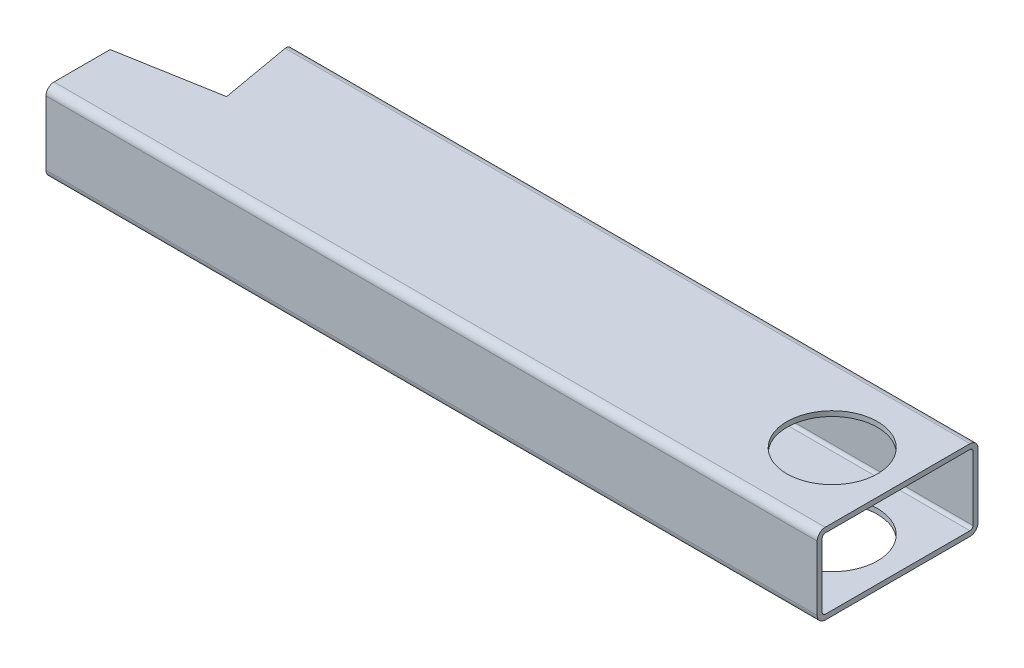
ISO-10303-21;
HEADER;
FILE_DESCRIPTION(('STEP AP214'),'2;1');
FILE_NAME('part.step','',(''),(''),'','','');
FILE_SCHEMA(('AUTOMOTIVE_DESIGN { 1 0 10303 214 1 1 1 1 }'));
ENDSEC;
DATA;
#1=APPLICATION_CONTEXT('core data for automotive mechanical design processes');
#2=APPLICATION_PROTOCOL_DEFINITION('international standard','automotive_design',2000,#1);
#3=PRODUCT_CONTEXT('',#1,'mechanical');
#4=PRODUCT('Part','Part','',(#3));
#5=PRODUCT_RELATED_PRODUCT_CATEGORY('part','',(#4));
#6=PRODUCT_DEFINITION_FORMATION('','',#4);
#7=PRODUCT_DEFINITION_CONTEXT('part definition',#1,'design');
#8=PRODUCT_DEFINITION('design','',#6,#7);
#9=PRODUCT_DEFINITION_SHAPE('','',#8);
#10=(LENGTH_UNIT() NAMED_UNIT(*) SI_UNIT(.MILLI.,.METRE.));
#11=(NAMED_UNIT(*) PLANE_ANGLE_UNIT() SI_UNIT($,.RADIAN.));
#12=(NAMED_UNIT(*) SI_UNIT($,.STERADIAN.) SOLID_ANGLE_UNIT());
#13=UNCERTAINTY_MEASURE_WITH_UNIT(LENGTH_MEASURE(1.E-05),#10,'distance_accuracy_value','');
#14=(GEOMETRIC_REPRESENTATION_CONTEXT(3) GLOBAL_UNCERTAINTY_ASSIGNED_CONTEXT((#13)) GLOBAL_UNIT_ASSIGNED_CONTEXT((#10,
#11,#12)) REPRESENTATION_CONTEXT('',''));
#15=CARTESIAN_POINT('',(0.,0.,0.));
#16=DIRECTION('',(0.,0.,1.));
#17=DIRECTION('',(1.,0.,0.));
#18=AXIS2_PLACEMENT_3D('',#15,#16,#17);
#19=CARTESIAN_POINT('',(-243.6368,2.53999999999999,48.26));
#20=DIRECTION('',(1.,0.,0.));
#21=DIRECTION('',(0.,0.,-1.));
#22=AXIS2_PLACEMENT_3D('',#19,#20,#21);
#23=CYLINDRICAL_SURFACE('',#22,2.54);
#24=CARTESIAN_POINT('',(0.,2.53999999999999,48.26));
#25=DIRECTION('',(1.,0.,0.));
#26=DIRECTION('',(0.,0.,-1.));
#27=AXIS2_PLACEMENT_3D('',#24,#25,#26);
#28=CIRCLE('',#27,2.54);
#29=CARTESIAN_POINT('',(0.,2.54000000000001,50.8));
#30=VERTEX_POINT('',#29);
#31=CARTESIAN_POINT('',(0.,0.,48.26));
#32=VERTEX_POINT('',#31);
#33=EDGE_CURVE('E381',#30,#32,#28,.T.);
#34=ORIENTED_EDGE('',*,*,#33,.F.);
#35=DIRECTION('',(1.,0.,0.));
#36=VECTOR('',#35,1.);
#37=CARTESIAN_POINT('',(-243.6368,2.54000000000001,50.8));
#38=LINE('',#37,#36);
#39=CARTESIAN_POINT('',(-243.6368,2.54000000000001,50.8));
#40=VERTEX_POINT('',#39);
#41=EDGE_CURVE('E448',#40,#30,#38,.T.);
#42=ORIENTED_EDGE('',*,*,#41,.F.);
#43=CARTESIAN_POINT('',(-243.6368,2.53999999999999,48.26));
#44=DIRECTION('',(1.,0.,0.));
#45=DIRECTION('',(0.,0.,-1.));
#46=AXIS2_PLACEMENT_3D('',#43,#44,#45);
#47=CIRCLE('',#46,2.54);
#48=CARTESIAN_POINT('',(-243.6368,0.,48.26));
#49=VERTEX_POINT('',#48);
#50=EDGE_CURVE('E402',#40,#49,#47,.T.);
#51=ORIENTED_EDGE('',*,*,#50,.T.);
#52=DIRECTION('',(1.,0.,0.));
#53=VECTOR('',#52,1.);
#54=CARTESIAN_POINT('',(-243.6368,0.,48.26));
#55=LINE('',#54,#53);
#56=EDGE_CURVE('E420',#49,#32,#55,.T.);
#57=ORIENTED_EDGE('',*,*,#56,.T.);
#58=EDGE_LOOP('',(#34,#42,#51,#57));
#59=FACE_BOUND('',#58,.T.);
#60=ADVANCED_FACE('F93',(#59),#23,.T.);
#61=CARTESIAN_POINT('',(-243.6368,2.54000000000001,50.8));
#62=DIRECTION('',(0.,0.,1.));
#63=DIRECTION('',(1.,0.,0.));
#64=AXIS2_PLACEMENT_3D('',#61,#62,#63);
#65=PLANE('',#64);
#66=DIRECTION('',(0.,-1.,0.));
#67=VECTOR('',#66,1.);
#68=CARTESIAN_POINT('',(0.,2.54000000000001,50.8));
#69=LINE('',#68,#67);
#70=CARTESIAN_POINT('',(0.,22.86,50.8));
#71=VERTEX_POINT('',#70);
#72=EDGE_CURVE('E406',#71,#30,#69,.T.);
#73=ORIENTED_EDGE('',*,*,#72,.F.);
#74=DIRECTION('',(1.,0.,0.));
#75=VECTOR('',#74,1.);
#76=CARTESIAN_POINT('',(-243.6368,22.86,50.8));
#77=LINE('',#76,#75);
#78=CARTESIAN_POINT('',(-243.6368,22.86,50.8));
#79=VERTEX_POINT('',#78);
#80=EDGE_CURVE('E451',#79,#71,#77,.T.);
#81=ORIENTED_EDGE('',*,*,#80,.F.);
#82=DIRECTION('',(0.,-1.,0.));
#83=VECTOR('',#82,1.);
#84=CARTESIAN_POINT('',(-243.6368,2.54000000000001,50.8));
#85=LINE('',#84,#83);
#86=EDGE_CURVE('E416',#79,#40,#85,.T.);
#87=ORIENTED_EDGE('',*,*,#86,.T.);
#88=ORIENTED_EDGE('',*,*,#41,.T.);
#89=EDGE_LOOP('',(#73,#81,#87,#88));
#90=FACE_BOUND('',#89,.T.);
#91=ADVANCED_FACE('F542',(#90),#65,.T.);
#92=CARTESIAN_POINT('',(-243.6368,22.86,48.26));
#93=DIRECTION('',(1.,0.,0.));
#94=DIRECTION('',(0.,0.,-1.));
#95=AXIS2_PLACEMENT_3D('',#92,#93,#94);
#96=CYLINDRICAL_SURFACE('',#95,2.54);
#97=CARTESIAN_POINT('',(0.,22.86,48.26));
#98=DIRECTION('',(1.,0.,0.));
#99=DIRECTION('',(0.,0.,-1.));
#100=AXIS2_PLACEMENT_3D('',#97,#98,#99);
#101=CIRCLE('',#100,2.54);
#102=CARTESIAN_POINT('',(0.,25.4,48.26));
#103=VERTEX_POINT('',#102);
#104=EDGE_CURVE('E441',#103,#71,#101,.T.);
#105=ORIENTED_EDGE('',*,*,#104,.F.);
#106=DIRECTION('',(1.,0.,0.));
#107=VECTOR('',#106,1.);
#108=CARTESIAN_POINT('',(-243.6368,25.4,48.26));
#109=LINE('',#108,#107);
#110=CARTESIAN_POINT('',(-243.6368,25.4,48.26));
#111=VERTEX_POINT('',#110);
#112=EDGE_CURVE('E454',#111,#103,#109,.T.);
#113=ORIENTED_EDGE('',*,*,#112,.F.);
#114=CARTESIAN_POINT('',(-243.6368,22.86,48.26));
#115=DIRECTION('',(1.,0.,0.));
#116=DIRECTION('',(0.,0.,-1.));
#117=AXIS2_PLACEMENT_3D('',#114,#115,#116);
#118=CIRCLE('',#117,2.54);
#119=EDGE_CURVE('E412',#111,#79,#118,.T.);
#120=ORIENTED_EDGE('',*,*,#119,.T.);
#121=ORIENTED_EDGE('',*,*,#80,.T.);
#122=EDGE_LOOP('',(#105,#113,#120,#121));
#123=FACE_BOUND('',#122,.T.);
#124=ADVANCED_FACE('F546',(#123),#96,.T.);
#125=CARTESIAN_POINT('',(-243.6368,25.4,2.54000000000002));
#126=DIRECTION('',(0.,1.,0.));
#127=DIRECTION('',(0.,0.,1.));
#128=AXIS2_PLACEMENT_3D('',#125,#126,#127);
#129=PLANE('',#128);
#130=CARTESIAN_POINT('',(-20.6629,25.4,25.4));
#131=DIRECTION('',(0.,1.,0.));
#132=DIRECTION('',(0.,0.,1.));
#133=AXIS2_PLACEMENT_3D('',#130,#131,#132);
#134=CIRCLE('',#133,14.3129);
#135=CARTESIAN_POINT('',(-20.6629,25.4,39.7129));
#136=VERTEX_POINT('',#135);
#137=EDGE_CURVE('E327',#136,#136,#134,.T.);
#138=ORIENTED_EDGE('',*,*,#137,.F.);
#139=EDGE_LOOP('',(#138));
#140=FACE_BOUND('',#139,.T.);
#141=DIRECTION('',(-0.173648177666935,0.,-0.984807753012207));
#142=VECTOR('',#141,1.);
#143=CARTESIAN_POINT('',(-217.155289085019,25.4,-2.1294048642369));
#144=LINE('',#143,#142);
#145=CARTESIAN_POINT('',(-212.369153841862,25.4,25.01411692651));
#146=VERTEX_POINT('',#145);
#147=CARTESIAN_POINT('',(-216.331947023603,25.4,2.54000000000002));
#148=VERTEX_POINT('',#147);
#149=EDGE_CURVE('E320',#146,#148,#144,.T.);
#150=ORIENTED_EDGE('',*,*,#149,.F.);
#151=DIRECTION('',(0.984807753012207,0.,-0.173648177666935));
#152=VECTOR('',#151,1.);
#153=CARTESIAN_POINT('',(-238.850664756843,25.4,29.6835217907469));
#154=LINE('',#153,#152);
#155=CARTESIAN_POINT('',(-243.6368,25.4,30.5274465674352));
#156=VERTEX_POINT('',#155);
#157=EDGE_CURVE('E296',#156,#146,#154,.T.);
#158=ORIENTED_EDGE('',*,*,#157,.F.);
#159=DIRECTION('',(0.,0.,1.));
#160=VECTOR('',#159,1.);
#161=CARTESIAN_POINT('',(-243.6368,25.4,2.54000000000002));
#162=LINE('',#161,#160);
#163=EDGE_CURVE('E409',#156,#111,#162,.T.);
#164=ORIENTED_EDGE('',*,*,#163,.T.);
#165=ORIENTED_EDGE('',*,*,#112,.T.);
#166=DIRECTION('',(0.,0.,1.));
#167=VECTOR('',#166,1.);
#168=CARTESIAN_POINT('',(0.,25.4,2.54000000000002));
#169=LINE('',#168,#167);
#170=CARTESIAN_POINT('',(0.,25.4,2.54000000000002));
#171=VERTEX_POINT('',#170);
#172=EDGE_CURVE('E437',#171,#103,#169,.T.);
#173=ORIENTED_EDGE('',*,*,#172,.F.);
#174=DIRECTION('',(1.,0.,0.));
#175=VECTOR('',#174,1.);
#176=CARTESIAN_POINT('',(-243.6368,25.4,2.54000000000002));
#177=LINE('',#176,#175);
#178=EDGE_CURVE('E457',#148,#171,#177,.T.);
#179=ORIENTED_EDGE('',*,*,#178,.F.);
#180=EDGE_LOOP('',(#150,#158,#164,#165,#173,#179));
#181=FACE_BOUND('',#180,.T.);
#182=ADVANCED_FACE('F525',(#140,#181),#129,.T.);
#183=CARTESIAN_POINT('',(-243.6368,22.86,2.54));
#184=DIRECTION('',(1.,0.,0.));
#185=DIRECTION('',(0.,0.,-1.));
#186=AXIS2_PLACEMENT_3D('',#183,#184,#185);
#187=CYLINDRICAL_SURFACE('',#186,2.54);
#188=CARTESIAN_POINT('',(-216.331947023603,22.86,2.54));
#189=DIRECTION('',(0.984807753012207,0.,-0.173648177666935));
#190=DIRECTION('',(0.173648177666935,0.,0.984807753012207));
#191=AXIS2_PLACEMENT_3D('',#188,#189,#190);
#192=ELLIPSE('',#191,2.57918359418979,2.54);
#193=CARTESIAN_POINT('',(-216.779817554603,22.86,0.));
#194=VERTEX_POINT('',#193);
#195=EDGE_CURVE('E317',#148,#194,#192,.F.);
#196=ORIENTED_EDGE('',*,*,#195,.F.);
#197=ORIENTED_EDGE('',*,*,#178,.T.);
#198=CARTESIAN_POINT('',(0.,22.86,2.54));
#199=DIRECTION('',(1.,0.,0.));
#200=DIRECTION('',(0.,0.,-1.));
#201=AXIS2_PLACEMENT_3D('',#198,#199,#200);
#202=CIRCLE('',#201,2.54);
#203=CARTESIAN_POINT('',(0.,22.86,0.));
#204=VERTEX_POINT('',#203);
#205=EDGE_CURVE('E434',#204,#171,#202,.T.);
#206=ORIENTED_EDGE('',*,*,#205,.F.);
#207=DIRECTION('',(1.,0.,0.));
#208=VECTOR('',#207,1.);
#209=CARTESIAN_POINT('',(-243.6368,22.86,0.));
#210=LINE('',#209,#208);
#211=EDGE_CURVE('E460',#194,#204,#210,.T.);
#212=ORIENTED_EDGE('',*,*,#211,.F.);
#213=EDGE_LOOP('',(#196,#197,#206,#212));
#214=FACE_BOUND('',#213,.T.);
#215=ADVANCED_FACE('F529',(#214),#187,.T.);
#216=CARTESIAN_POINT('',(-243.6368,2.54000000000002,0.));
#217=DIRECTION('',(0.,0.,-1.));
#218=DIRECTION('',(-1.,0.,0.));
#219=AXIS2_PLACEMENT_3D('',#216,#217,#218);
#220=PLANE('',#219);
#221=DIRECTION('',(0.,1.,0.));
#222=VECTOR('',#221,1.);
#223=CARTESIAN_POINT('',(-216.779817554603,0.,0.));
#224=LINE('',#223,#222);
#225=CARTESIAN_POINT('',(-216.779817554603,2.54,0.));
#226=VERTEX_POINT('',#225);
#227=EDGE_CURVE('E514',#226,#194,#224,.T.);
#228=ORIENTED_EDGE('',*,*,#227,.T.);
#229=ORIENTED_EDGE('',*,*,#211,.T.);
#230=DIRECTION('',(0.,1.,0.));
#231=VECTOR('',#230,1.);
#232=CARTESIAN_POINT('',(0.,2.54000000000002,0.));
#233=LINE('',#232,#231);
#234=CARTESIAN_POINT('',(0.,2.54000000000002,0.));
#235=VERTEX_POINT('',#234);
#236=EDGE_CURVE('E431',#235,#204,#233,.T.);
#237=ORIENTED_EDGE('',*,*,#236,.F.);
#238=DIRECTION('',(1.,0.,0.));
#239=VECTOR('',#238,1.);
#240=CARTESIAN_POINT('',(-243.6368,2.54000000000002,0.));
#241=LINE('',#240,#239);
#242=EDGE_CURVE('E463',#226,#235,#241,.T.);
#243=ORIENTED_EDGE('',*,*,#242,.F.);
#244=EDGE_LOOP('',(#228,#229,#237,#243));
#245=FACE_BOUND('',#244,.T.);
#246=ADVANCED_FACE('F534',(#245),#220,.T.);
#247=CARTESIAN_POINT('',(-243.6368,2.54,2.54));
#248=DIRECTION('',(1.,0.,0.));
#249=DIRECTION('',(0.,0.,-1.));
#250=AXIS2_PLACEMENT_3D('',#247,#248,#249);
#251=CYLINDRICAL_SURFACE('',#250,2.54);
#252=CARTESIAN_POINT('',(-216.331947023603,2.54,2.54));
#253=DIRECTION('',(0.984807753012207,0.,-0.173648177666935));
#254=DIRECTION('',(0.173648177666935,0.,0.984807753012207));
#255=AXIS2_PLACEMENT_3D('',#252,#253,#254);
#256=ELLIPSE('',#255,2.57918359418979,2.54);
#257=CARTESIAN_POINT('',(-216.331947023603,0.,2.54000000000002));
#258=VERTEX_POINT('',#257);
#259=EDGE_CURVE('E275',#226,#258,#256,.F.);
#260=ORIENTED_EDGE('',*,*,#259,.F.);
#261=ORIENTED_EDGE('',*,*,#242,.T.);
#262=CARTESIAN_POINT('',(0.,2.54,2.54));
#263=DIRECTION('',(1.,0.,0.));
#264=DIRECTION('',(0.,0.,-1.));
#265=AXIS2_PLACEMENT_3D('',#262,#263,#264);
#266=CIRCLE('',#265,2.54);
#267=CARTESIAN_POINT('',(0.,0.,2.54000000000002));
#268=VERTEX_POINT('',#267);
#269=EDGE_CURVE('E428',#268,#235,#266,.T.);
#270=ORIENTED_EDGE('',*,*,#269,.F.);
#271=DIRECTION('',(1.,0.,0.));
#272=VECTOR('',#271,1.);
#273=CARTESIAN_POINT('',(-243.6368,0.,2.54000000000002));
#274=LINE('',#273,#272);
#275=EDGE_CURVE('E466',#258,#268,#274,.T.);
#276=ORIENTED_EDGE('',*,*,#275,.F.);
#277=EDGE_LOOP('',(#260,#261,#270,#276));
#278=FACE_BOUND('',#277,.T.);
#279=ADVANCED_FACE('F531',(#278),#251,.T.);
#280=CARTESIAN_POINT('',(-243.6368,0.,2.54000000000002));
#281=DIRECTION('',(0.,-1.,0.));
#282=DIRECTION('',(0.,0.,-1.));
#283=AXIS2_PLACEMENT_3D('',#280,#281,#282);
#284=PLANE('',#283);
#285=CARTESIAN_POINT('',(-20.6629,0.,25.3999999999999));
#286=DIRECTION('',(0.,1.,0.));
#287=DIRECTION('',(0.,0.,1.));
#288=AXIS2_PLACEMENT_3D('',#285,#286,#287);
#289=CIRCLE('',#288,14.3129);
#290=CARTESIAN_POINT('',(-20.6629,0.,39.7129));
#291=VERTEX_POINT('',#290);
#292=EDGE_CURVE('E285',#291,#291,#289,.T.);
#293=ORIENTED_EDGE('',*,*,#292,.T.);
#294=EDGE_LOOP('',(#293));
#295=FACE_BOUND('',#294,.T.);
#296=DIRECTION('',(-0.173648177666935,0.,-0.984807753012207));
#297=VECTOR('',#296,1.);
#298=CARTESIAN_POINT('',(-216.779817554603,0.,0.));
#299=LINE('',#298,#297);
#300=CARTESIAN_POINT('',(-212.369153841862,0.,25.01411692651));
#301=VERTEX_POINT('',#300);
#302=EDGE_CURVE('E272',#301,#258,#299,.T.);
#303=ORIENTED_EDGE('',*,*,#302,.T.);
#304=ORIENTED_EDGE('',*,*,#275,.T.);
#305=DIRECTION('',(0.,0.,-1.));
#306=VECTOR('',#305,1.);
#307=CARTESIAN_POINT('',(0.,0.,2.54000000000002));
#308=LINE('',#307,#306);
#309=EDGE_CURVE('E424',#32,#268,#308,.T.);
#310=ORIENTED_EDGE('',*,*,#309,.F.);
#311=ORIENTED_EDGE('',*,*,#56,.F.);
#312=DIRECTION('',(0.,0.,-1.));
#313=VECTOR('',#312,1.);
#314=CARTESIAN_POINT('',(-243.6368,0.,2.54000000000002));
#315=LINE('',#314,#313);
#316=CARTESIAN_POINT('',(-243.6368,0.,30.5274465674352));
#317=VERTEX_POINT('',#316);
#318=EDGE_CURVE('E283',#49,#317,#315,.T.);
#319=ORIENTED_EDGE('',*,*,#318,.T.);
#320=DIRECTION('',(0.984807753012207,0.,-0.173648177666935));
#321=VECTOR('',#320,1.);
#322=CARTESIAN_POINT('',(-212.369153841862,0.,25.01411692651));
#323=LINE('',#322,#321);
#324=EDGE_CURVE('E265',#317,#301,#323,.T.);
#325=ORIENTED_EDGE('',*,*,#324,.T.);
#326=EDGE_LOOP('',(#303,#304,#310,#311,#319,#325));
#327=FACE_BOUND('',#326,.T.);
#328=ADVANCED_FACE('F281',(#295,#327),#284,.T.);
#329=CARTESIAN_POINT('',(-243.6368,2.53999999999999,48.26));
#330=DIRECTION('',(1.,0.,0.));
#331=DIRECTION('',(0.,0.,-1.));
#332=AXIS2_PLACEMENT_3D('',#329,#330,#331);
#333=PLANE('',#332);
#334=ORIENTED_EDGE('',*,*,#163,.F.);
#335=DIRECTION('',(0.,1.,0.));
#336=VECTOR('',#335,1.);
#337=CARTESIAN_POINT('',(-243.6368,0.,30.5274465674352));
#338=LINE('',#337,#336);
#339=CARTESIAN_POINT('',(-243.6368,23.8125,30.5274465674352));
#340=VERTEX_POINT('',#339);
#341=EDGE_CURVE('E268',#340,#156,#338,.T.);
#342=ORIENTED_EDGE('',*,*,#341,.F.);
#343=DIRECTION('',(0.,0.,1.));
#344=VECTOR('',#343,1.);
#345=CARTESIAN_POINT('',(-243.6368,23.8125,2.54000000000002));
#346=LINE('',#345,#344);
#347=CARTESIAN_POINT('',(-243.6368,23.8125,48.26));
#348=VERTEX_POINT('',#347);
#349=EDGE_CURVE('E340',#340,#348,#346,.T.);
#350=ORIENTED_EDGE('',*,*,#349,.T.);
#351=CARTESIAN_POINT('',(-243.6368,22.86,48.26));
#352=DIRECTION('',(1.,0.,0.));
#353=DIRECTION('',(0.,0.,-1.));
#354=AXIS2_PLACEMENT_3D('',#351,#352,#353);
#355=CIRCLE('',#354,0.952500000000001);
#356=CARTESIAN_POINT('',(-243.6368,22.86,49.2125));
#357=VERTEX_POINT('',#356);
#358=EDGE_CURVE('E343',#348,#357,#355,.T.);
#359=ORIENTED_EDGE('',*,*,#358,.T.);
#360=DIRECTION('',(0.,-1.,0.));
#361=VECTOR('',#360,1.);
#362=CARTESIAN_POINT('',(-243.6368,2.54000000000001,49.2125));
#363=LINE('',#362,#361);
#364=CARTESIAN_POINT('',(-243.6368,2.54000000000001,49.2125));
#365=VERTEX_POINT('',#364);
#366=EDGE_CURVE('E347',#357,#365,#363,.T.);
#367=ORIENTED_EDGE('',*,*,#366,.T.);
#368=CARTESIAN_POINT('',(-243.6368,2.53999999999999,48.26));
#369=DIRECTION('',(1.,0.,0.));
#370=DIRECTION('',(0.,0.,-1.));
#371=AXIS2_PLACEMENT_3D('',#368,#369,#370);
#372=CIRCLE('',#371,0.952500000000001);
#373=CARTESIAN_POINT('',(-243.6368,1.58749999999999,48.26));
#374=VERTEX_POINT('',#373);
#375=EDGE_CURVE('E331',#365,#374,#372,.T.);
#376=ORIENTED_EDGE('',*,*,#375,.T.);
#377=DIRECTION('',(0.,0.,-1.));
#378=VECTOR('',#377,1.);
#379=CARTESIAN_POINT('',(-243.6368,1.5875,2.54000000000002));
#380=LINE('',#379,#378);
#381=CARTESIAN_POINT('',(-243.6368,1.5875,30.5274465674352));
#382=VERTEX_POINT('',#381);
#383=EDGE_CURVE('E335',#374,#382,#380,.T.);
#384=ORIENTED_EDGE('',*,*,#383,.T.);
#385=EDGE_CURVE('E112',#317,#382,#338,.T.);
#386=ORIENTED_EDGE('',*,*,#385,.F.);
#387=ORIENTED_EDGE('',*,*,#318,.F.);
#388=ORIENTED_EDGE('',*,*,#50,.F.);
#389=ORIENTED_EDGE('',*,*,#86,.F.);
#390=ORIENTED_EDGE('',*,*,#119,.F.);
#391=EDGE_LOOP('',(#334,#342,#350,#359,#367,#376,#384,#386,#387,#388,#389,#390));
#392=FACE_BOUND('',#391,.T.);
#393=ADVANCED_FACE('F479',(#392),#333,.F.);
#394=CARTESIAN_POINT('',(0.,2.53999999999999,48.26));
#395=DIRECTION('',(1.,0.,0.));
#396=DIRECTION('',(0.,0.,-1.));
#397=AXIS2_PLACEMENT_3D('',#394,#395,#396);
#398=PLANE('',#397);
#399=CARTESIAN_POINT('',(0.,2.53999999999999,48.26));
#400=DIRECTION('',(1.,0.,0.));
#401=DIRECTION('',(0.,0.,-1.));
#402=AXIS2_PLACEMENT_3D('',#399,#400,#401);
#403=CIRCLE('',#402,0.952500000000001);
#404=CARTESIAN_POINT('',(0.,2.54000000000001,49.2125));
#405=VERTEX_POINT('',#404);
#406=CARTESIAN_POINT('',(0.,1.58749999999999,48.26));
#407=VERTEX_POINT('',#406);
#408=EDGE_CURVE('E123',#405,#407,#403,.T.);
#409=ORIENTED_EDGE('',*,*,#408,.F.);
#410=DIRECTION('',(0.,-1.,0.));
#411=VECTOR('',#410,1.);
#412=CARTESIAN_POINT('',(0.,2.54000000000001,49.2125));
#413=LINE('',#412,#411);
#414=CARTESIAN_POINT('',(0.,22.86,49.2125));
#415=VERTEX_POINT('',#414);
#416=EDGE_CURVE('E336',#415,#405,#413,.T.);
#417=ORIENTED_EDGE('',*,*,#416,.F.);
#418=CARTESIAN_POINT('',(0.,22.86,48.26));
#419=DIRECTION('',(1.,0.,0.));
#420=DIRECTION('',(0.,0.,-1.));
#421=AXIS2_PLACEMENT_3D('',#418,#419,#420);
#422=CIRCLE('',#421,0.952500000000001);
#423=CARTESIAN_POINT('',(0.,23.8125,48.26));
#424=VERTEX_POINT('',#423);
#425=EDGE_CURVE('E371',#424,#415,#422,.T.);
#426=ORIENTED_EDGE('',*,*,#425,.F.);
#427=DIRECTION('',(0.,0.,1.));
#428=VECTOR('',#427,1.);
#429=CARTESIAN_POINT('',(0.,23.8125,2.54000000000002));
#430=LINE('',#429,#428);
#431=CARTESIAN_POINT('',(0.,23.8125,2.54000000000001));
#432=VERTEX_POINT('',#431);
#433=EDGE_CURVE('E367',#432,#424,#430,.T.);
#434=ORIENTED_EDGE('',*,*,#433,.F.);
#435=CARTESIAN_POINT('',(0.,22.86,2.54));
#436=DIRECTION('',(1.,0.,0.));
#437=DIRECTION('',(0.,0.,-1.));
#438=AXIS2_PLACEMENT_3D('',#435,#436,#437);
#439=CIRCLE('',#438,0.9525);
#440=CARTESIAN_POINT('',(0.,22.86,1.5875));
#441=VERTEX_POINT('',#440);
#442=EDGE_CURVE('E364',#441,#432,#439,.T.);
#443=ORIENTED_EDGE('',*,*,#442,.F.);
#444=DIRECTION('',(0.,1.,0.));
#445=VECTOR('',#444,1.);
#446=CARTESIAN_POINT('',(0.,2.54000000000002,1.5875));
#447=LINE('',#446,#445);
#448=CARTESIAN_POINT('',(0.,2.54000000000001,1.5875));
#449=VERTEX_POINT('',#448);
#450=EDGE_CURVE('E361',#449,#441,#447,.T.);
#451=ORIENTED_EDGE('',*,*,#450,.F.);
#452=CARTESIAN_POINT('',(0.,2.54,2.54));
#453=DIRECTION('',(1.,0.,0.));
#454=DIRECTION('',(0.,0.,-1.));
#455=AXIS2_PLACEMENT_3D('',#452,#453,#454);
#456=CIRCLE('',#455,0.9525);
#457=CARTESIAN_POINT('',(0.,1.5875,2.54000000000002));
#458=VERTEX_POINT('',#457);
#459=EDGE_CURVE('E358',#458,#449,#456,.T.);
#460=ORIENTED_EDGE('',*,*,#459,.F.);
#461=DIRECTION('',(0.,0.,-1.));
#462=VECTOR('',#461,1.);
#463=CARTESIAN_POINT('',(0.,1.5875,2.54000000000002));
#464=LINE('',#463,#462);
#465=EDGE_CURVE('E354',#407,#458,#464,.T.);
#466=ORIENTED_EDGE('',*,*,#465,.F.);
#467=EDGE_LOOP('',(#409,#417,#426,#434,#443,#451,#460,#466));
#468=FACE_BOUND('',#467,.T.);
#469=ORIENTED_EDGE('',*,*,#33,.T.);
#470=ORIENTED_EDGE('',*,*,#309,.T.);
#471=ORIENTED_EDGE('',*,*,#269,.T.);
#472=ORIENTED_EDGE('',*,*,#236,.T.);
#473=ORIENTED_EDGE('',*,*,#205,.T.);
#474=ORIENTED_EDGE('',*,*,#172,.T.);
#475=ORIENTED_EDGE('',*,*,#104,.T.);
#476=ORIENTED_EDGE('',*,*,#72,.T.);
#477=EDGE_LOOP('',(#469,#470,#471,#472,#473,#474,#475,#476));
#478=FACE_BOUND('',#477,.T.);
#479=ADVANCED_FACE('F486',(#468,#478),#398,.T.);
#480=CARTESIAN_POINT('',(-243.6368,2.53999999999999,48.26));
#481=DIRECTION('',(1.,0.,0.));
#482=DIRECTION('',(0.,0.,-1.));
#483=AXIS2_PLACEMENT_3D('',#480,#481,#482);
#484=CYLINDRICAL_SURFACE('',#483,0.952500000000001);
#485=ORIENTED_EDGE('',*,*,#408,.T.);
#486=DIRECTION('',(1.,0.,0.));
#487=VECTOR('',#486,1.);
#488=CARTESIAN_POINT('',(-243.6368,1.58749999999999,48.26));
#489=LINE('',#488,#487);
#490=EDGE_CURVE('E351',#374,#407,#489,.T.);
#491=ORIENTED_EDGE('',*,*,#490,.F.);
#492=ORIENTED_EDGE('',*,*,#375,.F.);
#493=DIRECTION('',(1.,0.,0.));
#494=VECTOR('',#493,1.);
#495=CARTESIAN_POINT('',(-243.6368,2.54000000000001,49.2125));
#496=LINE('',#495,#494);
#497=EDGE_CURVE('E378',#365,#405,#496,.T.);
#498=ORIENTED_EDGE('',*,*,#497,.T.);
#499=EDGE_LOOP('',(#485,#491,#492,#498));
#500=FACE_BOUND('',#499,.T.);
#501=ADVANCED_FACE('F482',(#500),#484,.F.);
#502=CARTESIAN_POINT('',(-243.6368,2.54000000000001,49.2125));
#503=DIRECTION('',(0.,0.,1.));
#504=DIRECTION('',(1.,0.,0.));
#505=AXIS2_PLACEMENT_3D('',#502,#503,#504);
#506=PLANE('',#505);
#507=ORIENTED_EDGE('',*,*,#416,.T.);
#508=ORIENTED_EDGE('',*,*,#497,.F.);
#509=ORIENTED_EDGE('',*,*,#366,.F.);
#510=DIRECTION('',(1.,0.,0.));
#511=VECTOR('',#510,1.);
#512=CARTESIAN_POINT('',(-243.6368,22.86,49.2125));
#513=LINE('',#512,#511);
#514=EDGE_CURVE('E382',#357,#415,#513,.T.);
#515=ORIENTED_EDGE('',*,*,#514,.T.);
#516=EDGE_LOOP('',(#507,#508,#509,#515));
#517=FACE_BOUND('',#516,.T.);
#518=ADVANCED_FACE('F682',(#517),#506,.F.);
#519=CARTESIAN_POINT('',(-243.6368,22.86,48.26));
#520=DIRECTION('',(1.,0.,0.));
#521=DIRECTION('',(0.,0.,-1.));
#522=AXIS2_PLACEMENT_3D('',#519,#520,#521);
#523=CYLINDRICAL_SURFACE('',#522,0.952500000000001);
#524=ORIENTED_EDGE('',*,*,#425,.T.);
#525=ORIENTED_EDGE('',*,*,#514,.F.);
#526=ORIENTED_EDGE('',*,*,#358,.F.);
#527=DIRECTION('',(1.,0.,0.));
#528=VECTOR('',#527,1.);
#529=CARTESIAN_POINT('',(-243.6368,23.8125,48.26));
#530=LINE('',#529,#528);
#531=EDGE_CURVE('E385',#348,#424,#530,.T.);
#532=ORIENTED_EDGE('',*,*,#531,.T.);
#533=EDGE_LOOP('',(#524,#525,#526,#532));
#534=FACE_BOUND('',#533,.T.);
#535=ADVANCED_FACE('F672',(#534),#523,.F.);
#536=CARTESIAN_POINT('',(-243.6368,23.8125,2.54000000000002));
#537=DIRECTION('',(0.,1.,0.));
#538=DIRECTION('',(0.,0.,1.));
#539=AXIS2_PLACEMENT_3D('',#536,#537,#538);
#540=PLANE('',#539);
#541=CARTESIAN_POINT('',(-20.6629,23.8125,25.4));
#542=DIRECTION('',(0.,1.,0.));
#543=DIRECTION('',(0.,0.,1.));
#544=AXIS2_PLACEMENT_3D('',#541,#542,#543);
#545=CIRCLE('',#544,14.3129);
#546=CARTESIAN_POINT('',(-20.6629,23.8125,39.7129));
#547=VERTEX_POINT('',#546);
#548=EDGE_CURVE('E323',#547,#547,#545,.T.);
#549=ORIENTED_EDGE('',*,*,#548,.T.);
#550=EDGE_LOOP('',(#549));
#551=FACE_BOUND('',#550,.T.);
#552=DIRECTION('',(0.984807753012207,0.,-0.173648177666935));
#553=VECTOR('',#552,1.);
#554=CARTESIAN_POINT('',(-238.850664756843,23.8125,29.6835217907469));
#555=LINE('',#554,#553);
#556=CARTESIAN_POINT('',(-212.369153841862,23.8125,25.01411692651));
#557=VERTEX_POINT('',#556);
#558=EDGE_CURVE('E289',#340,#557,#555,.T.);
#559=ORIENTED_EDGE('',*,*,#558,.T.);
#560=DIRECTION('',(-0.173648177666935,0.,-0.984807753012207));
#561=VECTOR('',#560,1.);
#562=CARTESIAN_POINT('',(-217.155289085019,23.8125,-2.1294048642369));
#563=LINE('',#562,#561);
#564=CARTESIAN_POINT('',(-216.331947023603,23.8125,2.54000000000001));
#565=VERTEX_POINT('',#564);
#566=EDGE_CURVE('E311',#557,#565,#563,.T.);
#567=ORIENTED_EDGE('',*,*,#566,.T.);
#568=DIRECTION('',(1.,0.,0.));
#569=VECTOR('',#568,1.);
#570=CARTESIAN_POINT('',(-243.6368,23.8125,2.54000000000001));
#571=LINE('',#570,#569);
#572=EDGE_CURVE('E388',#565,#432,#571,.T.);
#573=ORIENTED_EDGE('',*,*,#572,.T.);
#574=ORIENTED_EDGE('',*,*,#433,.T.);
#575=ORIENTED_EDGE('',*,*,#531,.F.);
#576=ORIENTED_EDGE('',*,*,#349,.F.);
#577=EDGE_LOOP('',(#559,#567,#573,#574,#575,#576));
#578=FACE_BOUND('',#577,.T.);
#579=ADVANCED_FACE('F504',(#551,#578),#540,.F.);
#580=CARTESIAN_POINT('',(-243.6368,22.86,2.54));
#581=DIRECTION('',(1.,0.,0.));
#582=DIRECTION('',(0.,0.,-1.));
#583=AXIS2_PLACEMENT_3D('',#580,#581,#582);
#584=CYLINDRICAL_SURFACE('',#583,0.9525);
#585=ORIENTED_EDGE('',*,*,#572,.F.);
#586=CARTESIAN_POINT('',(-216.331947023603,22.86,2.54));
#587=DIRECTION('',(0.984807753012207,0.,-0.173648177666935));
#588=DIRECTION('',(0.173648177666935,0.,0.984807753012207));
#589=AXIS2_PLACEMENT_3D('',#586,#587,#588);
#590=ELLIPSE('',#589,0.967193847821173,0.9525);
#591=CARTESIAN_POINT('',(-216.499898472728,22.86,1.5875));
#592=VERTEX_POINT('',#591);
#593=EDGE_CURVE('E307',#565,#592,#590,.F.);
#594=ORIENTED_EDGE('',*,*,#593,.T.);
#595=DIRECTION('',(1.,0.,0.));
#596=VECTOR('',#595,1.);
#597=CARTESIAN_POINT('',(-243.6368,22.86,1.5875));
#598=LINE('',#597,#596);
#599=EDGE_CURVE('E391',#592,#441,#598,.T.);
#600=ORIENTED_EDGE('',*,*,#599,.T.);
#601=ORIENTED_EDGE('',*,*,#442,.T.);
#602=EDGE_LOOP('',(#585,#594,#600,#601));
#603=FACE_BOUND('',#602,.T.);
#604=ADVANCED_FACE('F499',(#603),#584,.F.);
#605=CARTESIAN_POINT('',(-243.6368,2.54000000000002,1.5875));
#606=DIRECTION('',(0.,0.,-1.));
#607=DIRECTION('',(-1.,0.,0.));
#608=AXIS2_PLACEMENT_3D('',#605,#606,#607);
#609=PLANE('',#608);
#610=ORIENTED_EDGE('',*,*,#599,.F.);
#611=DIRECTION('',(0.,-1.,0.));
#612=VECTOR('',#611,1.);
#613=CARTESIAN_POINT('',(-216.499898472728,2.54000000000002,1.5875));
#614=LINE('',#613,#612);
#615=CARTESIAN_POINT('',(-216.499898472728,2.54000000000001,1.5875));
#616=VERTEX_POINT('',#615);
#617=EDGE_CURVE('E303',#592,#616,#614,.T.);
#618=ORIENTED_EDGE('',*,*,#617,.T.);
#619=DIRECTION('',(1.,0.,0.));
#620=VECTOR('',#619,1.);
#621=CARTESIAN_POINT('',(-243.6368,2.54000000000001,1.5875));
#622=LINE('',#621,#620);
#623=EDGE_CURVE('E394',#616,#449,#622,.T.);
#624=ORIENTED_EDGE('',*,*,#623,.T.);
#625=ORIENTED_EDGE('',*,*,#450,.T.);
#626=EDGE_LOOP('',(#610,#618,#624,#625));
#627=FACE_BOUND('',#626,.T.);
#628=ADVANCED_FACE('F496',(#627),#609,.F.);
#629=CARTESIAN_POINT('',(-243.6368,2.54,2.54));
#630=DIRECTION('',(1.,0.,0.));
#631=DIRECTION('',(0.,0.,-1.));
#632=AXIS2_PLACEMENT_3D('',#629,#630,#631);
#633=CYLINDRICAL_SURFACE('',#632,0.9525);
#634=ORIENTED_EDGE('',*,*,#623,.F.);
#635=CARTESIAN_POINT('',(-216.331947023603,2.54,2.54));
#636=DIRECTION('',(0.984807753012207,0.,-0.173648177666935));
#637=DIRECTION('',(0.173648177666935,0.,0.984807753012207));
#638=AXIS2_PLACEMENT_3D('',#635,#636,#637);
#639=ELLIPSE('',#638,0.967193847821173,0.9525);
#640=CARTESIAN_POINT('',(-216.331947023603,1.5875,2.54000000000002));
#641=VERTEX_POINT('',#640);
#642=EDGE_CURVE('E299',#616,#641,#639,.F.);
#643=ORIENTED_EDGE('',*,*,#642,.T.);
#644=DIRECTION('',(1.,0.,0.));
#645=VECTOR('',#644,1.);
#646=CARTESIAN_POINT('',(-243.6368,1.5875,2.54000000000002));
#647=LINE('',#646,#645);
#648=EDGE_CURVE('E397',#641,#458,#647,.T.);
#649=ORIENTED_EDGE('',*,*,#648,.T.);
#650=ORIENTED_EDGE('',*,*,#459,.T.);
#651=EDGE_LOOP('',(#634,#643,#649,#650));
#652=FACE_BOUND('',#651,.T.);
#653=ADVANCED_FACE('F493',(#652),#633,.F.);
#654=CARTESIAN_POINT('',(-243.6368,1.5875,2.54000000000002));
#655=DIRECTION('',(0.,-1.,0.));
#656=DIRECTION('',(0.,0.,-1.));
#657=AXIS2_PLACEMENT_3D('',#654,#655,#656);
#658=PLANE('',#657);
#659=CARTESIAN_POINT('',(-20.6629,1.5875,25.3999999999999));
#660=DIRECTION('',(0.,-1.,0.));
#661=DIRECTION('',(0.,0.,-1.));
#662=AXIS2_PLACEMENT_3D('',#659,#660,#661);
#663=CIRCLE('',#662,14.3129);
#664=CARTESIAN_POINT('',(-20.6629,1.5875,11.0870999999999));
#665=VERTEX_POINT('',#664);
#666=EDGE_CURVE('E96',#665,#665,#663,.T.);
#667=ORIENTED_EDGE('',*,*,#666,.T.);
#668=EDGE_LOOP('',(#667));
#669=FACE_BOUND('',#668,.T.);
#670=ORIENTED_EDGE('',*,*,#648,.F.);
#671=DIRECTION('',(0.173648177666935,0.,0.984807753012207));
#672=VECTOR('',#671,1.);
#673=CARTESIAN_POINT('',(-217.155289085019,1.5875,-2.1294048642369));
#674=LINE('',#673,#672);
#675=CARTESIAN_POINT('',(-212.369153841862,1.5875,25.01411692651));
#676=VERTEX_POINT('',#675);
#677=EDGE_CURVE('E12',#641,#676,#674,.T.);
#678=ORIENTED_EDGE('',*,*,#677,.T.);
#679=DIRECTION('',(-0.984807753012207,0.,0.173648177666935));
#680=VECTOR('',#679,1.);
#681=CARTESIAN_POINT('',(-238.850664756843,1.5875,29.6835217907469));
#682=LINE('',#681,#680);
#683=EDGE_CURVE('E102',#676,#382,#682,.T.);
#684=ORIENTED_EDGE('',*,*,#683,.T.);
#685=ORIENTED_EDGE('',*,*,#383,.F.);
#686=ORIENTED_EDGE('',*,*,#490,.T.);
#687=ORIENTED_EDGE('',*,*,#465,.T.);
#688=EDGE_LOOP('',(#670,#678,#684,#685,#686,#687));
#689=FACE_BOUND('',#688,.T.);
#690=ADVANCED_FACE('F476',(#669,#689),#658,.F.);
#691=CARTESIAN_POINT('',(-216.779817554603,0.,0.));
#692=DIRECTION('',(0.984807753012207,0.,-0.173648177666935));
#693=DIRECTION('',(-0.173648177666935,0.,-0.984807753012207));
#694=AXIS2_PLACEMENT_3D('',#691,#692,#693);
#695=PLANE('',#694);
#696=ORIENTED_EDGE('',*,*,#149,.T.);
#697=ORIENTED_EDGE('',*,*,#195,.T.);
#698=ORIENTED_EDGE('',*,*,#227,.F.);
#699=ORIENTED_EDGE('',*,*,#259,.T.);
#700=ORIENTED_EDGE('',*,*,#302,.F.);
#701=DIRECTION('',(0.,1.,0.));
#702=VECTOR('',#701,1.);
#703=CARTESIAN_POINT('',(-212.369153841862,0.,25.01411692651));
#704=LINE('',#703,#702);
#705=EDGE_CURVE('E261',#301,#676,#704,.T.);
#706=ORIENTED_EDGE('',*,*,#705,.T.);
#707=ORIENTED_EDGE('',*,*,#677,.F.);
#708=ORIENTED_EDGE('',*,*,#642,.F.);
#709=ORIENTED_EDGE('',*,*,#617,.F.);
#710=ORIENTED_EDGE('',*,*,#593,.F.);
#711=ORIENTED_EDGE('',*,*,#566,.F.);
#712=EDGE_CURVE('E269',#557,#146,#704,.T.);
#713=ORIENTED_EDGE('',*,*,#712,.T.);
#714=EDGE_LOOP('',(#696,#697,#698,#699,#700,#706,#707,#708,#709,#710,#711,#713));
#715=FACE_BOUND('',#714,.T.);
#716=ADVANCED_FACE('F273',(#715),#695,.F.);
#717=CARTESIAN_POINT('',(-212.369153841862,0.,25.01411692651));
#718=DIRECTION('',(0.173648177666935,0.,0.984807753012207));
#719=DIRECTION('',(0.984807753012207,0.,-0.173648177666935));
#720=AXIS2_PLACEMENT_3D('',#717,#718,#719);
#721=PLANE('',#720);
#722=ORIENTED_EDGE('',*,*,#157,.T.);
#723=ORIENTED_EDGE('',*,*,#712,.F.);
#724=ORIENTED_EDGE('',*,*,#558,.F.);
#725=ORIENTED_EDGE('',*,*,#341,.T.);
#726=EDGE_LOOP('',(#722,#723,#724,#725));
#727=FACE_BOUND('',#726,.T.);
#728=ADVANCED_FACE('F509',(#727),#721,.F.);
#729=ORIENTED_EDGE('',*,*,#705,.F.);
#730=ORIENTED_EDGE('',*,*,#324,.F.);
#731=ORIENTED_EDGE('',*,*,#385,.T.);
#732=ORIENTED_EDGE('',*,*,#683,.F.);
#733=EDGE_LOOP('',(#729,#730,#731,#732));
#734=FACE_BOUND('',#733,.T.);
#735=ADVANCED_FACE('F263',(#734),#721,.F.);
#736=CARTESIAN_POINT('',(-20.6629,0.,25.3999999999999));
#737=DIRECTION('',(0.,1.,0.));
#738=DIRECTION('',(0.,0.,1.));
#739=AXIS2_PLACEMENT_3D('',#736,#737,#738);
#740=CYLINDRICAL_SURFACE('',#739,14.3129);
#741=ORIENTED_EDGE('',*,*,#292,.F.);
#742=EDGE_LOOP('',(#741));
#743=FACE_BOUND('',#742,.T.);
#744=ORIENTED_EDGE('',*,*,#666,.F.);
#745=EDGE_LOOP('',(#744));
#746=FACE_BOUND('',#745,.T.);
#747=ADVANCED_FACE('F621',(#743,#746),#740,.F.);
#748=ORIENTED_EDGE('',*,*,#137,.T.);
#749=EDGE_LOOP('',(#748));
#750=FACE_BOUND('',#749,.T.);
#751=ORIENTED_EDGE('',*,*,#548,.F.);
#752=EDGE_LOOP('',(#751));
#753=FACE_BOUND('',#752,.T.);
#754=ADVANCED_FACE('F630',(#750,#753),#740,.F.);
#755=CLOSED_SHELL('',(#60,#91,#124,#182,#215,#246,#279,#328,#393,#479,#501,#518,#535,#579,#604,
#628,#653,#690,#716,#728,#735,#747,#754));
#756=MANIFOLD_SOLID_BREP('B2',#755);
#757=ADVANCED_BREP_SHAPE_REPRESENTATION('',(#18,#756),#14);
#758=SHAPE_DEFINITION_REPRESENTATION(#9,#757);
ENDSEC;
END-ISO-10303-21;
